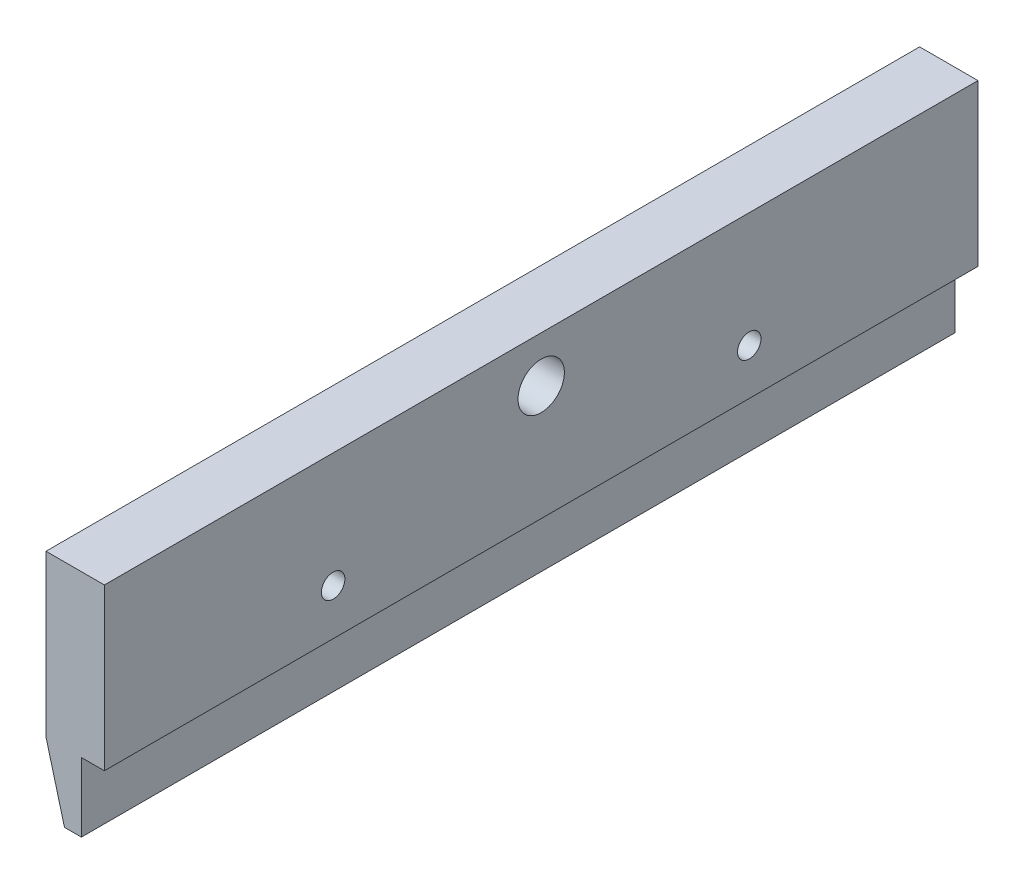
ISO-10303-21;
HEADER;
FILE_DESCRIPTION(('STEP AP214'),'2;1');
FILE_NAME('part.step','',(''),(''),'','','');
FILE_SCHEMA(('AUTOMOTIVE_DESIGN { 1 0 10303 214 1 1 1 1 }'));
ENDSEC;
DATA;
#1=APPLICATION_CONTEXT('core data for automotive mechanical design processes');
#2=APPLICATION_PROTOCOL_DEFINITION('international standard','automotive_design',2000,#1);
#3=PRODUCT_CONTEXT('',#1,'mechanical');
#4=PRODUCT('Part','Part','',(#3));
#5=PRODUCT_RELATED_PRODUCT_CATEGORY('part','',(#4));
#6=PRODUCT_DEFINITION_FORMATION('','',#4);
#7=PRODUCT_DEFINITION_CONTEXT('part definition',#1,'design');
#8=PRODUCT_DEFINITION('design','',#6,#7);
#9=PRODUCT_DEFINITION_SHAPE('','',#8);
#10=(LENGTH_UNIT() NAMED_UNIT(*) SI_UNIT(.MILLI.,.METRE.));
#11=(NAMED_UNIT(*) PLANE_ANGLE_UNIT() SI_UNIT($,.RADIAN.));
#12=(NAMED_UNIT(*) SI_UNIT($,.STERADIAN.) SOLID_ANGLE_UNIT());
#13=UNCERTAINTY_MEASURE_WITH_UNIT(LENGTH_MEASURE(1.E-05),#10,'distance_accuracy_value','');
#14=(GEOMETRIC_REPRESENTATION_CONTEXT(3) GLOBAL_UNCERTAINTY_ASSIGNED_CONTEXT((#13)) GLOBAL_UNIT_ASSIGNED_CONTEXT((#10,
#11,#12)) REPRESENTATION_CONTEXT('',''));
#15=CARTESIAN_POINT('',(0.,0.,0.));
#16=DIRECTION('',(0.,0.,1.));
#17=DIRECTION('',(1.,0.,0.));
#18=AXIS2_PLACEMENT_3D('',#15,#16,#17);
#19=CARTESIAN_POINT('',(-6.35,17.5,95.));
#20=DIRECTION('',(1.,0.,0.));
#21=DIRECTION('',(0.,0.,-1.));
#22=AXIS2_PLACEMENT_3D('',#19,#20,#21);
#23=PLANE('',#22);
#24=CARTESIAN_POINT('',(-6.35000000000008,7.5,0.));
#25=DIRECTION('',(1.,0.,0.));
#26=DIRECTION('',(0.,0.,-1.));
#27=AXIS2_PLACEMENT_3D('',#24,#25,#26);
#28=CIRCLE('',#27,5.0419);
#29=CARTESIAN_POINT('',(-6.35000000000008,7.5,-5.0419));
#30=VERTEX_POINT('',#29);
#31=EDGE_CURVE('E172',#30,#30,#28,.T.);
#32=ORIENTED_EDGE('',*,*,#31,.T.);
#33=EDGE_LOOP('',(#32));
#34=FACE_BOUND('',#33,.T.);
#35=CARTESIAN_POINT('',(-6.35000000000006,-7.50000000000001,-45.25));
#36=DIRECTION('',(1.,0.,0.));
#37=DIRECTION('',(0.,0.,-1.));
#38=AXIS2_PLACEMENT_3D('',#35,#36,#37);
#39=CIRCLE('',#38,2.5527);
#40=CARTESIAN_POINT('',(-6.35000000000006,-7.50000000000001,-47.8027));
#41=VERTEX_POINT('',#40);
#42=EDGE_CURVE('E166',#41,#41,#39,.T.);
#43=ORIENTED_EDGE('',*,*,#42,.T.);
#44=EDGE_LOOP('',(#43));
#45=FACE_BOUND('',#44,.T.);
#46=CARTESIAN_POINT('',(-6.35000000000006,-7.50000000000001,45.25));
#47=DIRECTION('',(1.,0.,0.));
#48=DIRECTION('',(0.,0.,-1.));
#49=AXIS2_PLACEMENT_3D('',#46,#47,#48);
#50=CIRCLE('',#49,2.5527);
#51=CARTESIAN_POINT('',(-6.35000000000006,-7.50000000000001,42.6973));
#52=VERTEX_POINT('',#51);
#53=EDGE_CURVE('E129',#52,#52,#50,.T.);
#54=ORIENTED_EDGE('',*,*,#53,.T.);
#55=EDGE_LOOP('',(#54));
#56=FACE_BOUND('',#55,.T.);
#57=DIRECTION('',(0.,-1.,0.));
#58=VECTOR('',#57,1.);
#59=CARTESIAN_POINT('',(-6.35,17.5,-95.));
#60=LINE('',#59,#58);
#61=CARTESIAN_POINT('',(-6.35,17.5,-95.));
#62=VERTEX_POINT('',#61);
#63=CARTESIAN_POINT('',(-6.35,-17.5,-95.));
#64=VERTEX_POINT('',#63);
#65=EDGE_CURVE('E125',#62,#64,#60,.T.);
#66=ORIENTED_EDGE('',*,*,#65,.T.);
#67=DIRECTION('',(0.,0.,-1.));
#68=VECTOR('',#67,1.);
#69=CARTESIAN_POINT('',(-6.35,-17.5,95.));
#70=LINE('',#69,#68);
#71=CARTESIAN_POINT('',(-6.35,-17.5,95.));
#72=VERTEX_POINT('',#71);
#73=EDGE_CURVE('E11',#72,#64,#70,.T.);
#74=ORIENTED_EDGE('',*,*,#73,.F.);
#75=DIRECTION('',(0.,-1.,0.));
#76=VECTOR('',#75,1.);
#77=CARTESIAN_POINT('',(-6.35,17.5,95.));
#78=LINE('',#77,#76);
#79=CARTESIAN_POINT('',(-6.35,17.5,95.));
#80=VERTEX_POINT('',#79);
#81=EDGE_CURVE('E138',#80,#72,#78,.T.);
#82=ORIENTED_EDGE('',*,*,#81,.F.);
#83=DIRECTION('',(0.,0.,-1.));
#84=VECTOR('',#83,1.);
#85=CARTESIAN_POINT('',(-6.35,17.5,95.));
#86=LINE('',#85,#84);
#87=EDGE_CURVE('E121',#80,#62,#86,.T.);
#88=ORIENTED_EDGE('',*,*,#87,.T.);
#89=EDGE_LOOP('',(#66,#74,#82,#88));
#90=FACE_BOUND('',#89,.T.);
#91=ADVANCED_FACE('F35',(#34,#45,#56,#90),#23,.F.);
#92=CARTESIAN_POINT('',(-2.33076211353326,-32.5,95.));
#93=DIRECTION('',(0.96592582628907,0.258819045102515,0.));
#94=DIRECTION('',(-0.258819045102515,0.96592582628907,0.));
#95=AXIS2_PLACEMENT_3D('',#92,#93,#94);
#96=PLANE('',#95);
#97=DIRECTION('',(0.258819045102515,-0.96592582628907,0.));
#98=VECTOR('',#97,1.);
#99=CARTESIAN_POINT('',(-2.33076211353326,-32.5,-95.));
#100=LINE('',#99,#98);
#101=CARTESIAN_POINT('',(-2.33076211353326,-32.5,-95.));
#102=VERTEX_POINT('',#101);
#103=EDGE_CURVE('E128',#64,#102,#100,.T.);
#104=ORIENTED_EDGE('',*,*,#103,.T.);
#105=DIRECTION('',(0.,0.,-1.));
#106=VECTOR('',#105,1.);
#107=CARTESIAN_POINT('',(-2.33076211353326,-32.5,95.));
#108=LINE('',#107,#106);
#109=CARTESIAN_POINT('',(-2.33076211353326,-32.5,95.));
#110=VERTEX_POINT('',#109);
#111=EDGE_CURVE('E43',#110,#102,#108,.T.);
#112=ORIENTED_EDGE('',*,*,#111,.F.);
#113=DIRECTION('',(0.258819045102515,-0.96592582628907,0.));
#114=VECTOR('',#113,1.);
#115=CARTESIAN_POINT('',(-2.33076211353326,-32.5,95.));
#116=LINE('',#115,#114);
#117=EDGE_CURVE('E91',#72,#110,#116,.T.);
#118=ORIENTED_EDGE('',*,*,#117,.F.);
#119=ORIENTED_EDGE('',*,*,#73,.T.);
#120=EDGE_LOOP('',(#104,#112,#118,#119));
#121=FACE_BOUND('',#120,.T.);
#122=ADVANCED_FACE('F204',(#121),#96,.F.);
#123=CARTESIAN_POINT('',(-2.33076211353326,-32.5,95.));
#124=DIRECTION('',(0.,1.,0.));
#125=DIRECTION('',(0.,0.,1.));
#126=AXIS2_PLACEMENT_3D('',#123,#124,#125);
#127=PLANE('',#126);
#128=DIRECTION('',(1.,0.,0.));
#129=VECTOR('',#128,1.);
#130=CARTESIAN_POINT('',(-2.33076211353326,-32.5,-95.));
#131=LINE('',#130,#129);
#132=CARTESIAN_POINT('',(1.35,-32.5,-95.));
#133=VERTEX_POINT('',#132);
#134=EDGE_CURVE('E131',#102,#133,#131,.T.);
#135=ORIENTED_EDGE('',*,*,#134,.T.);
#136=DIRECTION('',(0.,0.,-1.));
#137=VECTOR('',#136,1.);
#138=CARTESIAN_POINT('',(1.35,-32.5,95.));
#139=LINE('',#138,#137);
#140=CARTESIAN_POINT('',(1.35,-32.5,95.));
#141=VERTEX_POINT('',#140);
#142=EDGE_CURVE('E142',#141,#133,#139,.T.);
#143=ORIENTED_EDGE('',*,*,#142,.F.);
#144=DIRECTION('',(1.,0.,0.));
#145=VECTOR('',#144,1.);
#146=CARTESIAN_POINT('',(-2.33076211353326,-32.5,95.));
#147=LINE('',#146,#145);
#148=EDGE_CURVE('E150',#110,#141,#147,.T.);
#149=ORIENTED_EDGE('',*,*,#148,.F.);
#150=ORIENTED_EDGE('',*,*,#111,.T.);
#151=EDGE_LOOP('',(#135,#143,#149,#150));
#152=FACE_BOUND('',#151,.T.);
#153=ADVANCED_FACE('F148',(#152),#127,.F.);
#154=CARTESIAN_POINT('',(1.35,-17.5,95.));
#155=DIRECTION('',(-1.,0.,0.));
#156=DIRECTION('',(0.,-1.,0.));
#157=AXIS2_PLACEMENT_3D('',#154,#155,#156);
#158=PLANE('',#157);
#159=DIRECTION('',(0.,1.,0.));
#160=VECTOR('',#159,1.);
#161=CARTESIAN_POINT('',(1.35,-17.5,-95.));
#162=LINE('',#161,#160);
#163=CARTESIAN_POINT('',(1.35,-17.5,-95.));
#164=VERTEX_POINT('',#163);
#165=EDGE_CURVE('E133',#133,#164,#162,.T.);
#166=ORIENTED_EDGE('',*,*,#165,.T.);
#167=DIRECTION('',(0.,0.,-1.));
#168=VECTOR('',#167,1.);
#169=CARTESIAN_POINT('',(1.35,-17.5,95.));
#170=LINE('',#169,#168);
#171=CARTESIAN_POINT('',(1.35,-17.5,95.));
#172=VERTEX_POINT('',#171);
#173=EDGE_CURVE('E116',#172,#164,#170,.T.);
#174=ORIENTED_EDGE('',*,*,#173,.F.);
#175=DIRECTION('',(0.,1.,0.));
#176=VECTOR('',#175,1.);
#177=CARTESIAN_POINT('',(1.35,-17.5,95.));
#178=LINE('',#177,#176);
#179=EDGE_CURVE('E107',#141,#172,#178,.T.);
#180=ORIENTED_EDGE('',*,*,#179,.F.);
#181=ORIENTED_EDGE('',*,*,#142,.T.);
#182=EDGE_LOOP('',(#166,#174,#180,#181));
#183=FACE_BOUND('',#182,.T.);
#184=ADVANCED_FACE('F156',(#183),#158,.F.);
#185=CARTESIAN_POINT('',(6.35,-17.5,95.));
#186=DIRECTION('',(0.,1.,0.));
#187=DIRECTION('',(-1.,0.,0.));
#188=AXIS2_PLACEMENT_3D('',#185,#186,#187);
#189=PLANE('',#188);
#190=DIRECTION('',(1.,0.,0.));
#191=VECTOR('',#190,1.);
#192=CARTESIAN_POINT('',(6.35,-17.5,-95.));
#193=LINE('',#192,#191);
#194=CARTESIAN_POINT('',(6.35,-17.5,-95.));
#195=VERTEX_POINT('',#194);
#196=EDGE_CURVE('E115',#164,#195,#193,.T.);
#197=ORIENTED_EDGE('',*,*,#196,.T.);
#198=DIRECTION('',(0.,0.,-1.));
#199=VECTOR('',#198,1.);
#200=CARTESIAN_POINT('',(6.35,-17.5,95.));
#201=LINE('',#200,#199);
#202=CARTESIAN_POINT('',(6.35,-17.5,95.));
#203=VERTEX_POINT('',#202);
#204=EDGE_CURVE('E112',#203,#195,#201,.T.);
#205=ORIENTED_EDGE('',*,*,#204,.F.);
#206=DIRECTION('',(1.,0.,0.));
#207=VECTOR('',#206,1.);
#208=CARTESIAN_POINT('',(6.35,-17.5,95.));
#209=LINE('',#208,#207);
#210=EDGE_CURVE('E101',#172,#203,#209,.T.);
#211=ORIENTED_EDGE('',*,*,#210,.F.);
#212=ORIENTED_EDGE('',*,*,#173,.T.);
#213=EDGE_LOOP('',(#197,#205,#211,#212));
#214=FACE_BOUND('',#213,.T.);
#215=ADVANCED_FACE('F113',(#214),#189,.F.);
#216=CARTESIAN_POINT('',(6.35,17.5,95.));
#217=DIRECTION('',(-1.,0.,0.));
#218=DIRECTION('',(0.,0.,1.));
#219=AXIS2_PLACEMENT_3D('',#216,#217,#218);
#220=PLANE('',#219);
#221=CARTESIAN_POINT('',(6.35,7.5,0.));
#222=DIRECTION('',(1.,0.,0.));
#223=DIRECTION('',(0.,0.,-1.));
#224=AXIS2_PLACEMENT_3D('',#221,#222,#223);
#225=CIRCLE('',#224,5.0419);
#226=CARTESIAN_POINT('',(6.35,7.5,-5.0419));
#227=VERTEX_POINT('',#226);
#228=EDGE_CURVE('E175',#227,#227,#225,.T.);
#229=ORIENTED_EDGE('',*,*,#228,.F.);
#230=EDGE_LOOP('',(#229));
#231=FACE_BOUND('',#230,.T.);
#232=CARTESIAN_POINT('',(6.35,-7.50000000000001,-45.25));
#233=DIRECTION('',(1.,0.,0.));
#234=DIRECTION('',(0.,0.,-1.));
#235=AXIS2_PLACEMENT_3D('',#232,#233,#234);
#236=CIRCLE('',#235,2.5527);
#237=CARTESIAN_POINT('',(6.35,-7.50000000000001,-47.8027));
#238=VERTEX_POINT('',#237);
#239=EDGE_CURVE('E169',#238,#238,#236,.T.);
#240=ORIENTED_EDGE('',*,*,#239,.F.);
#241=EDGE_LOOP('',(#240));
#242=FACE_BOUND('',#241,.T.);
#243=CARTESIAN_POINT('',(6.35,-7.50000000000001,45.25));
#244=DIRECTION('',(1.,0.,0.));
#245=DIRECTION('',(0.,0.,-1.));
#246=AXIS2_PLACEMENT_3D('',#243,#244,#245);
#247=CIRCLE('',#246,2.5527);
#248=CARTESIAN_POINT('',(6.35,-7.50000000000001,42.6973));
#249=VERTEX_POINT('',#248);
#250=EDGE_CURVE('E163',#249,#249,#247,.T.);
#251=ORIENTED_EDGE('',*,*,#250,.F.);
#252=EDGE_LOOP('',(#251));
#253=FACE_BOUND('',#252,.T.);
#254=DIRECTION('',(0.,1.,0.));
#255=VECTOR('',#254,1.);
#256=CARTESIAN_POINT('',(6.35,17.5,-95.));
#257=LINE('',#256,#255);
#258=CARTESIAN_POINT('',(6.35,17.5,-95.));
#259=VERTEX_POINT('',#258);
#260=EDGE_CURVE('E77',#195,#259,#257,.T.);
#261=ORIENTED_EDGE('',*,*,#260,.T.);
#262=DIRECTION('',(0.,0.,-1.));
#263=VECTOR('',#262,1.);
#264=CARTESIAN_POINT('',(6.35,17.5,95.));
#265=LINE('',#264,#263);
#266=CARTESIAN_POINT('',(6.35,17.5,95.));
#267=VERTEX_POINT('',#266);
#268=EDGE_CURVE('E117',#267,#259,#265,.T.);
#269=ORIENTED_EDGE('',*,*,#268,.F.);
#270=DIRECTION('',(0.,1.,0.));
#271=VECTOR('',#270,1.);
#272=CARTESIAN_POINT('',(6.35,17.5,95.));
#273=LINE('',#272,#271);
#274=EDGE_CURVE('E105',#203,#267,#273,.T.);
#275=ORIENTED_EDGE('',*,*,#274,.F.);
#276=ORIENTED_EDGE('',*,*,#204,.T.);
#277=EDGE_LOOP('',(#261,#269,#275,#276));
#278=FACE_BOUND('',#277,.T.);
#279=ADVANCED_FACE('F119',(#231,#242,#253,#278),#220,.F.);
#280=CARTESIAN_POINT('',(-6.35,17.5,95.));
#281=DIRECTION('',(0.,-1.,0.));
#282=DIRECTION('',(0.,0.,-1.));
#283=AXIS2_PLACEMENT_3D('',#280,#281,#282);
#284=PLANE('',#283);
#285=DIRECTION('',(-1.,0.,0.));
#286=VECTOR('',#285,1.);
#287=CARTESIAN_POINT('',(-6.35,17.5,-95.));
#288=LINE('',#287,#286);
#289=EDGE_CURVE('E83',#259,#62,#288,.T.);
#290=ORIENTED_EDGE('',*,*,#289,.T.);
#291=ORIENTED_EDGE('',*,*,#87,.F.);
#292=DIRECTION('',(-1.,0.,0.));
#293=VECTOR('',#292,1.);
#294=CARTESIAN_POINT('',(-6.35,17.5,95.));
#295=LINE('',#294,#293);
#296=EDGE_CURVE('E51',#267,#80,#295,.T.);
#297=ORIENTED_EDGE('',*,*,#296,.F.);
#298=ORIENTED_EDGE('',*,*,#268,.T.);
#299=EDGE_LOOP('',(#290,#291,#297,#298));
#300=FACE_BOUND('',#299,.T.);
#301=ADVANCED_FACE('F183',(#300),#284,.F.);
#302=CARTESIAN_POINT('',(0.,0.,95.));
#303=DIRECTION('',(0.,0.,1.));
#304=DIRECTION('',(1.,0.,0.));
#305=AXIS2_PLACEMENT_3D('',#302,#303,#304);
#306=PLANE('',#305);
#307=ORIENTED_EDGE('',*,*,#81,.T.);
#308=ORIENTED_EDGE('',*,*,#117,.T.);
#309=ORIENTED_EDGE('',*,*,#148,.T.);
#310=ORIENTED_EDGE('',*,*,#179,.T.);
#311=ORIENTED_EDGE('',*,*,#210,.T.);
#312=ORIENTED_EDGE('',*,*,#274,.T.);
#313=ORIENTED_EDGE('',*,*,#296,.T.);
#314=EDGE_LOOP('',(#307,#308,#309,#310,#311,#312,#313));
#315=FACE_BOUND('',#314,.T.);
#316=ADVANCED_FACE('F103',(#315),#306,.T.);
#317=CARTESIAN_POINT('',(0.,0.,-95.));
#318=DIRECTION('',(0.,0.,1.));
#319=DIRECTION('',(1.,0.,0.));
#320=AXIS2_PLACEMENT_3D('',#317,#318,#319);
#321=PLANE('',#320);
#322=ORIENTED_EDGE('',*,*,#65,.F.);
#323=ORIENTED_EDGE('',*,*,#289,.F.);
#324=ORIENTED_EDGE('',*,*,#260,.F.);
#325=ORIENTED_EDGE('',*,*,#196,.F.);
#326=ORIENTED_EDGE('',*,*,#165,.F.);
#327=ORIENTED_EDGE('',*,*,#134,.F.);
#328=ORIENTED_EDGE('',*,*,#103,.F.);
#329=EDGE_LOOP('',(#322,#323,#324,#325,#326,#327,#328));
#330=FACE_BOUND('',#329,.T.);
#331=ADVANCED_FACE('F154',(#330),#321,.F.);
#332=CARTESIAN_POINT('',(6.35,-7.50000000000001,45.25));
#333=DIRECTION('',(1.,0.,0.));
#334=DIRECTION('',(0.,0.,-1.));
#335=AXIS2_PLACEMENT_3D('',#332,#333,#334);
#336=CYLINDRICAL_SURFACE('',#335,2.5527);
#337=ORIENTED_EDGE('',*,*,#53,.F.);
#338=EDGE_LOOP('',(#337));
#339=FACE_BOUND('',#338,.T.);
#340=ORIENTED_EDGE('',*,*,#250,.T.);
#341=EDGE_LOOP('',(#340));
#342=FACE_BOUND('',#341,.T.);
#343=ADVANCED_FACE('F189',(#339,#342),#336,.F.);
#344=CARTESIAN_POINT('',(6.35,-7.50000000000001,-45.25));
#345=DIRECTION('',(1.,0.,0.));
#346=DIRECTION('',(0.,0.,-1.));
#347=AXIS2_PLACEMENT_3D('',#344,#345,#346);
#348=CYLINDRICAL_SURFACE('',#347,2.5527);
#349=ORIENTED_EDGE('',*,*,#42,.F.);
#350=EDGE_LOOP('',(#349));
#351=FACE_BOUND('',#350,.T.);
#352=ORIENTED_EDGE('',*,*,#239,.T.);
#353=EDGE_LOOP('',(#352));
#354=FACE_BOUND('',#353,.T.);
#355=ADVANCED_FACE('F191',(#351,#354),#348,.F.);
#356=CARTESIAN_POINT('',(6.35,7.5,0.));
#357=DIRECTION('',(1.,0.,0.));
#358=DIRECTION('',(0.,0.,-1.));
#359=AXIS2_PLACEMENT_3D('',#356,#357,#358);
#360=CYLINDRICAL_SURFACE('',#359,5.0419);
#361=ORIENTED_EDGE('',*,*,#31,.F.);
#362=EDGE_LOOP('',(#361));
#363=FACE_BOUND('',#362,.T.);
#364=ORIENTED_EDGE('',*,*,#228,.T.);
#365=EDGE_LOOP('',(#364));
#366=FACE_BOUND('',#365,.T.);
#367=ADVANCED_FACE('F179',(#363,#366),#360,.F.);
#368=CLOSED_SHELL('',(#91,#122,#153,#184,#215,#279,#301,#316,#331,#343,#355,#367));
#369=MANIFOLD_SOLID_BREP('B2',#368);
#370=ADVANCED_BREP_SHAPE_REPRESENTATION('',(#18,#369),#14);
#371=SHAPE_DEFINITION_REPRESENTATION(#9,#370);
ENDSEC;
END-ISO-10303-21;
